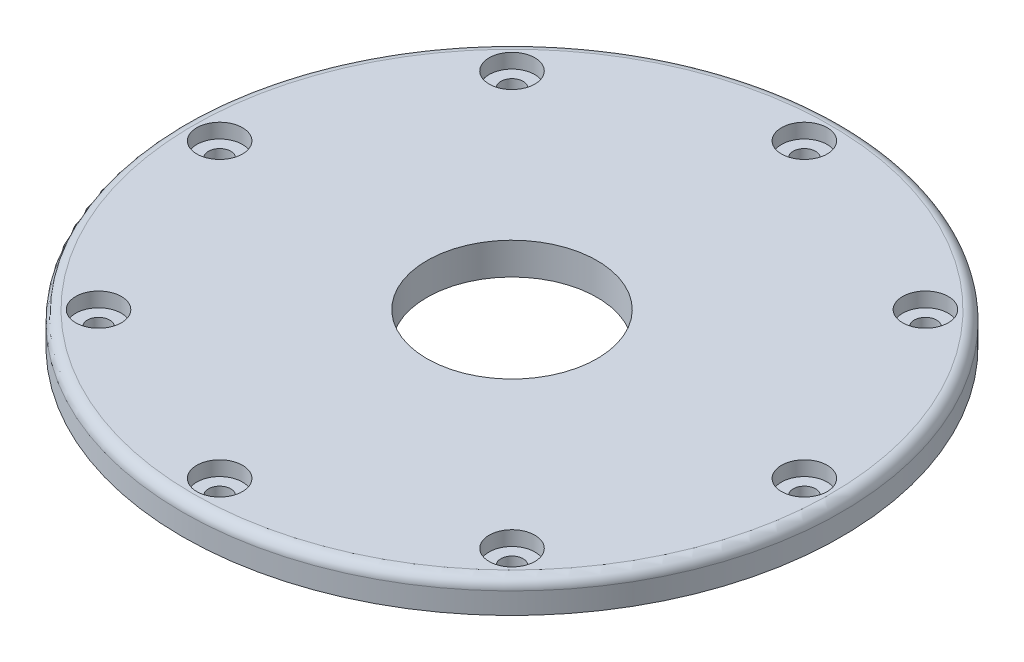
ISO-10303-21;
HEADER;
FILE_DESCRIPTION(('STEP AP214'),'2;1');
FILE_NAME('part.step','',(''),(''),'','','');
FILE_SCHEMA(('AUTOMOTIVE_DESIGN { 1 0 10303 214 1 1 1 1 }'));
ENDSEC;
DATA;
#1=APPLICATION_CONTEXT('core data for automotive mechanical design processes');
#2=APPLICATION_PROTOCOL_DEFINITION('international standard','automotive_design',2000,#1);
#3=PRODUCT_CONTEXT('',#1,'mechanical');
#4=PRODUCT('Part','Part','',(#3));
#5=PRODUCT_RELATED_PRODUCT_CATEGORY('part','',(#4));
#6=PRODUCT_DEFINITION_FORMATION('','',#4);
#7=PRODUCT_DEFINITION_CONTEXT('part definition',#1,'design');
#8=PRODUCT_DEFINITION('design','',#6,#7);
#9=PRODUCT_DEFINITION_SHAPE('','',#8);
#10=(LENGTH_UNIT() NAMED_UNIT(*) SI_UNIT(.MILLI.,.METRE.));
#11=(NAMED_UNIT(*) PLANE_ANGLE_UNIT() SI_UNIT($,.RADIAN.));
#12=(NAMED_UNIT(*) SI_UNIT($,.STERADIAN.) SOLID_ANGLE_UNIT());
#13=UNCERTAINTY_MEASURE_WITH_UNIT(LENGTH_MEASURE(1.E-05),#10,'distance_accuracy_value','');
#14=(GEOMETRIC_REPRESENTATION_CONTEXT(3) GLOBAL_UNCERTAINTY_ASSIGNED_CONTEXT((#13)) GLOBAL_UNIT_ASSIGNED_CONTEXT((#10,
#11,#12)) REPRESENTATION_CONTEXT('',''));
#15=CARTESIAN_POINT('',(0.,0.,0.));
#16=DIRECTION('',(0.,0.,1.));
#17=DIRECTION('',(1.,0.,0.));
#18=AXIS2_PLACEMENT_3D('',#15,#16,#17);
#19=CARTESIAN_POINT('',(0.,15.,0.));
#20=DIRECTION('',(0.,-1.,0.));
#21=DIRECTION('',(0.,0.,-1.));
#22=AXIS2_PLACEMENT_3D('',#19,#20,#21);
#23=CYLINDRICAL_SURFACE('',#22,155.);
#24=CARTESIAN_POINT('',(0.,10.,0.));
#25=DIRECTION('',(0.,1.,0.));
#26=DIRECTION('',(0.,0.,1.));
#27=AXIS2_PLACEMENT_3D('',#24,#25,#26);
#28=CIRCLE('',#27,155.);
#29=CARTESIAN_POINT('',(0.,10.,155.));
#30=VERTEX_POINT('',#29);
#31=EDGE_CURVE('E10',#30,#30,#28,.F.);
#32=ORIENTED_EDGE('',*,*,#31,.T.);
#33=EDGE_LOOP('',(#32));
#34=FACE_BOUND('',#33,.T.);
#35=CARTESIAN_POINT('',(0.,0.,0.));
#36=DIRECTION('',(0.,1.,0.));
#37=DIRECTION('',(0.,0.,1.));
#38=AXIS2_PLACEMENT_3D('',#35,#36,#37);
#39=CIRCLE('',#38,155.);
#40=CARTESIAN_POINT('',(0.,0.,155.));
#41=VERTEX_POINT('',#40);
#42=EDGE_CURVE('E41',#41,#41,#39,.T.);
#43=ORIENTED_EDGE('',*,*,#42,.T.);
#44=EDGE_LOOP('',(#43));
#45=FACE_BOUND('',#44,.T.);
#46=ADVANCED_FACE('F30',(#34,#45),#23,.T.);
#47=CARTESIAN_POINT('',(0.,15.,0.));
#48=DIRECTION('',(0.,1.,0.));
#49=DIRECTION('',(0.,0.,1.));
#50=AXIS2_PLACEMENT_3D('',#47,#48,#49);
#51=PLANE('',#50);
#52=CARTESIAN_POINT('',(0.,15.,0.));
#53=DIRECTION('',(0.,1.,0.));
#54=DIRECTION('',(0.,0.,1.));
#55=AXIS2_PLACEMENT_3D('',#52,#53,#54);
#56=CIRCLE('',#55,150.);
#57=CARTESIAN_POINT('',(0.,15.,150.));
#58=VERTEX_POINT('',#57);
#59=EDGE_CURVE('E37',#58,#58,#56,.T.);
#60=ORIENTED_EDGE('',*,*,#59,.T.);
#61=EDGE_LOOP('',(#60));
#62=FACE_BOUND('',#61,.T.);
#63=CARTESIAN_POINT('',(0.,15.,0.));
#64=DIRECTION('',(0.,1.,0.));
#65=DIRECTION('',(0.,0.,1.));
#66=AXIS2_PLACEMENT_3D('',#63,#64,#65);
#67=CIRCLE('',#66,40.);
#68=CARTESIAN_POINT('',(0.,15.,40.));
#69=VERTEX_POINT('',#68);
#70=EDGE_CURVE('E144',#69,#69,#67,.T.);
#71=ORIENTED_EDGE('',*,*,#70,.F.);
#72=EDGE_LOOP('',(#71));
#73=FACE_BOUND('',#72,.T.);
#74=CARTESIAN_POINT('',(97.2271824131491,15.,-97.2271824131515));
#75=DIRECTION('',(0.,1.,0.));
#76=DIRECTION('',(0.,0.,1.));
#77=AXIS2_PLACEMENT_3D('',#74,#75,#76);
#78=CIRCLE('',#77,10.74);
#79=CARTESIAN_POINT('',(97.2271824131491,15.,-86.4871824131515));
#80=VERTEX_POINT('',#79);
#81=EDGE_CURVE('E140',#80,#80,#78,.T.);
#82=ORIENTED_EDGE('',*,*,#81,.F.);
#83=EDGE_LOOP('',(#82));
#84=FACE_BOUND('',#83,.T.);
#85=CARTESIAN_POINT('',(137.5,15.,-1.44023605227279E-12));
#86=DIRECTION('',(0.,1.,0.));
#87=DIRECTION('',(0.,0.,1.));
#88=AXIS2_PLACEMENT_3D('',#85,#86,#87);
#89=CIRCLE('',#88,10.74);
#90=CARTESIAN_POINT('',(137.5,15.,10.7399999999986));
#91=VERTEX_POINT('',#90);
#92=EDGE_CURVE('E128',#91,#91,#89,.T.);
#93=ORIENTED_EDGE('',*,*,#92,.F.);
#94=EDGE_LOOP('',(#93));
#95=FACE_BOUND('',#94,.T.);
#96=CARTESIAN_POINT('',(97.2271824131511,15.,97.2271824131494));
#97=DIRECTION('',(0.,1.,0.));
#98=DIRECTION('',(0.,0.,1.));
#99=AXIS2_PLACEMENT_3D('',#96,#97,#98);
#100=CIRCLE('',#99,10.74);
#101=CARTESIAN_POINT('',(97.2271824131511,15.,107.967182413149));
#102=VERTEX_POINT('',#101);
#103=EDGE_CURVE('E116',#102,#102,#100,.T.);
#104=ORIENTED_EDGE('',*,*,#103,.F.);
#105=EDGE_LOOP('',(#104));
#106=FACE_BOUND('',#105,.T.);
#107=CARTESIAN_POINT('',(0.,15.,137.5));
#108=DIRECTION('',(0.,1.,0.));
#109=DIRECTION('',(0.,0.,1.));
#110=AXIS2_PLACEMENT_3D('',#107,#108,#109);
#111=CIRCLE('',#110,10.74);
#112=CARTESIAN_POINT('',(0.,15.,148.24));
#113=VERTEX_POINT('',#112);
#114=EDGE_CURVE('E104',#113,#113,#111,.T.);
#115=ORIENTED_EDGE('',*,*,#114,.F.);
#116=EDGE_LOOP('',(#115));
#117=FACE_BOUND('',#116,.T.);
#118=CARTESIAN_POINT('',(-97.2271824131498,15.,97.2271824131508));
#119=DIRECTION('',(0.,1.,0.));
#120=DIRECTION('',(0.,0.,1.));
#121=AXIS2_PLACEMENT_3D('',#118,#119,#120);
#122=CIRCLE('',#121,10.74);
#123=CARTESIAN_POINT('',(-97.2271824131498,15.,107.967182413151));
#124=VERTEX_POINT('',#123);
#125=EDGE_CURVE('E92',#124,#124,#122,.T.);
#126=ORIENTED_EDGE('',*,*,#125,.F.);
#127=EDGE_LOOP('',(#126));
#128=FACE_BOUND('',#127,.T.);
#129=CARTESIAN_POINT('',(-137.5,15.,4.80078684090931E-13));
#130=DIRECTION('',(0.,1.,0.));
#131=DIRECTION('',(0.,0.,1.));
#132=AXIS2_PLACEMENT_3D('',#129,#130,#131);
#133=CIRCLE('',#132,10.74);
#134=CARTESIAN_POINT('',(-137.5,15.,10.7400000000005));
#135=VERTEX_POINT('',#134);
#136=EDGE_CURVE('E80',#135,#135,#133,.T.);
#137=ORIENTED_EDGE('',*,*,#136,.F.);
#138=EDGE_LOOP('',(#137));
#139=FACE_BOUND('',#138,.T.);
#140=CARTESIAN_POINT('',(-97.2271824131505,15.,-97.2271824131501));
#141=DIRECTION('',(0.,1.,0.));
#142=DIRECTION('',(0.,0.,1.));
#143=AXIS2_PLACEMENT_3D('',#140,#141,#142);
#144=CIRCLE('',#143,10.74);
#145=CARTESIAN_POINT('',(-97.2271824131505,15.,-86.4871824131501));
#146=VERTEX_POINT('',#145);
#147=EDGE_CURVE('E68',#146,#146,#144,.T.);
#148=ORIENTED_EDGE('',*,*,#147,.F.);
#149=EDGE_LOOP('',(#148));
#150=FACE_BOUND('',#149,.T.);
#151=CARTESIAN_POINT('',(0.,15.,-137.5));
#152=DIRECTION('',(0.,1.,0.));
#153=DIRECTION('',(0.,0.,1.));
#154=AXIS2_PLACEMENT_3D('',#151,#152,#153);
#155=CIRCLE('',#154,10.74);
#156=CARTESIAN_POINT('',(0.,15.,-126.76));
#157=VERTEX_POINT('',#156);
#158=EDGE_CURVE('E56',#157,#157,#155,.T.);
#159=ORIENTED_EDGE('',*,*,#158,.F.);
#160=EDGE_LOOP('',(#159));
#161=FACE_BOUND('',#160,.T.);
#162=ADVANCED_FACE('F160',(#62,#73,#84,#95,#106,#117,#128,#139,#150,#161),#51,.T.);
#163=CARTESIAN_POINT('',(0.,0.,0.));
#164=DIRECTION('',(0.,1.,0.));
#165=DIRECTION('',(0.,0.,1.));
#166=AXIS2_PLACEMENT_3D('',#163,#164,#165);
#167=PLANE('',#166);
#168=CARTESIAN_POINT('',(0.,0.,0.));
#169=DIRECTION('',(0.,1.,0.));
#170=DIRECTION('',(0.,0.,1.));
#171=AXIS2_PLACEMENT_3D('',#168,#169,#170);
#172=CIRCLE('',#171,40.);
#173=CARTESIAN_POINT('',(0.,0.,40.));
#174=VERTEX_POINT('',#173);
#175=EDGE_CURVE('E143',#174,#174,#172,.T.);
#176=ORIENTED_EDGE('',*,*,#175,.T.);
#177=EDGE_LOOP('',(#176));
#178=FACE_BOUND('',#177,.T.);
#179=CARTESIAN_POINT('',(97.2271824131491,0.,-97.2271824131515));
#180=DIRECTION('',(0.,1.,0.));
#181=DIRECTION('',(0.,0.,1.));
#182=AXIS2_PLACEMENT_3D('',#179,#180,#181);
#183=CIRCLE('',#182,5.25);
#184=CARTESIAN_POINT('',(97.2271824131491,0.,-91.9771824131515));
#185=VERTEX_POINT('',#184);
#186=EDGE_CURVE('E131',#185,#185,#183,.T.);
#187=ORIENTED_EDGE('',*,*,#186,.T.);
#188=EDGE_LOOP('',(#187));
#189=FACE_BOUND('',#188,.T.);
#190=CARTESIAN_POINT('',(137.5,0.,-1.44023605227279E-12));
#191=DIRECTION('',(0.,1.,0.));
#192=DIRECTION('',(0.,0.,1.));
#193=AXIS2_PLACEMENT_3D('',#190,#191,#192);
#194=CIRCLE('',#193,5.25);
#195=CARTESIAN_POINT('',(137.5,0.,5.24999999999856));
#196=VERTEX_POINT('',#195);
#197=EDGE_CURVE('E119',#196,#196,#194,.T.);
#198=ORIENTED_EDGE('',*,*,#197,.T.);
#199=EDGE_LOOP('',(#198));
#200=FACE_BOUND('',#199,.T.);
#201=CARTESIAN_POINT('',(97.2271824131511,0.,97.2271824131494));
#202=DIRECTION('',(0.,1.,0.));
#203=DIRECTION('',(0.,0.,1.));
#204=AXIS2_PLACEMENT_3D('',#201,#202,#203);
#205=CIRCLE('',#204,5.25);
#206=CARTESIAN_POINT('',(97.2271824131511,0.,102.477182413149));
#207=VERTEX_POINT('',#206);
#208=EDGE_CURVE('E107',#207,#207,#205,.T.);
#209=ORIENTED_EDGE('',*,*,#208,.T.);
#210=EDGE_LOOP('',(#209));
#211=FACE_BOUND('',#210,.T.);
#212=CARTESIAN_POINT('',(0.,0.,137.5));
#213=DIRECTION('',(0.,1.,0.));
#214=DIRECTION('',(0.,0.,1.));
#215=AXIS2_PLACEMENT_3D('',#212,#213,#214);
#216=CIRCLE('',#215,5.25);
#217=CARTESIAN_POINT('',(0.,0.,142.75));
#218=VERTEX_POINT('',#217);
#219=EDGE_CURVE('E95',#218,#218,#216,.T.);
#220=ORIENTED_EDGE('',*,*,#219,.T.);
#221=EDGE_LOOP('',(#220));
#222=FACE_BOUND('',#221,.T.);
#223=CARTESIAN_POINT('',(-97.2271824131498,0.,97.2271824131508));
#224=DIRECTION('',(0.,1.,0.));
#225=DIRECTION('',(0.,0.,1.));
#226=AXIS2_PLACEMENT_3D('',#223,#224,#225);
#227=CIRCLE('',#226,5.25);
#228=CARTESIAN_POINT('',(-97.2271824131498,0.,102.477182413151));
#229=VERTEX_POINT('',#228);
#230=EDGE_CURVE('E83',#229,#229,#227,.T.);
#231=ORIENTED_EDGE('',*,*,#230,.T.);
#232=EDGE_LOOP('',(#231));
#233=FACE_BOUND('',#232,.T.);
#234=CARTESIAN_POINT('',(-137.5,0.,4.80078684090931E-13));
#235=DIRECTION('',(0.,1.,0.));
#236=DIRECTION('',(0.,0.,1.));
#237=AXIS2_PLACEMENT_3D('',#234,#235,#236);
#238=CIRCLE('',#237,5.25);
#239=CARTESIAN_POINT('',(-137.5,0.,5.25000000000048));
#240=VERTEX_POINT('',#239);
#241=EDGE_CURVE('E71',#240,#240,#238,.T.);
#242=ORIENTED_EDGE('',*,*,#241,.T.);
#243=EDGE_LOOP('',(#242));
#244=FACE_BOUND('',#243,.T.);
#245=CARTESIAN_POINT('',(-97.2271824131505,0.,-97.2271824131501));
#246=DIRECTION('',(0.,1.,0.));
#247=DIRECTION('',(0.,0.,1.));
#248=AXIS2_PLACEMENT_3D('',#245,#246,#247);
#249=CIRCLE('',#248,5.25);
#250=CARTESIAN_POINT('',(-97.2271824131505,0.,-91.9771824131501));
#251=VERTEX_POINT('',#250);
#252=EDGE_CURVE('E59',#251,#251,#249,.T.);
#253=ORIENTED_EDGE('',*,*,#252,.T.);
#254=EDGE_LOOP('',(#253));
#255=FACE_BOUND('',#254,.T.);
#256=CARTESIAN_POINT('',(0.,0.,-137.5));
#257=DIRECTION('',(0.,1.,0.));
#258=DIRECTION('',(0.,0.,1.));
#259=AXIS2_PLACEMENT_3D('',#256,#257,#258);
#260=CIRCLE('',#259,5.25);
#261=CARTESIAN_POINT('',(0.,0.,-132.25));
#262=VERTEX_POINT('',#261);
#263=EDGE_CURVE('E45',#262,#262,#260,.T.);
#264=ORIENTED_EDGE('',*,*,#263,.T.);
#265=EDGE_LOOP('',(#264));
#266=FACE_BOUND('',#265,.T.);
#267=ORIENTED_EDGE('',*,*,#42,.F.);
#268=EDGE_LOOP('',(#267));
#269=FACE_BOUND('',#268,.T.);
#270=ADVANCED_FACE('F150',(#178,#189,#200,#211,#222,#233,#244,#255,#266,#269),#167,.F.);
#271=CARTESIAN_POINT('',(0.,15.,-137.5));
#272=DIRECTION('',(0.,1.,0.));
#273=DIRECTION('',(0.,0.,1.));
#274=AXIS2_PLACEMENT_3D('',#271,#272,#273);
#275=CYLINDRICAL_SURFACE('',#274,5.25000000000001);
#276=ORIENTED_EDGE('',*,*,#263,.F.);
#277=EDGE_LOOP('',(#276));
#278=FACE_BOUND('',#277,.T.);
#279=CARTESIAN_POINT('',(0.,8.15,-137.5));
#280=DIRECTION('',(0.,1.,0.));
#281=DIRECTION('',(0.,0.,1.));
#282=AXIS2_PLACEMENT_3D('',#279,#280,#281);
#283=CIRCLE('',#282,5.25000000000001);
#284=CARTESIAN_POINT('',(0.,8.15,-132.25));
#285=VERTEX_POINT('',#284);
#286=EDGE_CURVE('E50',#285,#285,#283,.T.);
#287=ORIENTED_EDGE('',*,*,#286,.T.);
#288=EDGE_LOOP('',(#287));
#289=FACE_BOUND('',#288,.T.);
#290=ADVANCED_FACE('F193',(#278,#289),#275,.F.);
#291=CARTESIAN_POINT('',(5.25000000000001,8.15,-137.5));
#292=DIRECTION('',(0.,-1.,0.));
#293=DIRECTION('',(0.,0.,-1.));
#294=AXIS2_PLACEMENT_3D('',#291,#292,#293);
#295=PLANE('',#294);
#296=ORIENTED_EDGE('',*,*,#286,.F.);
#297=EDGE_LOOP('',(#296));
#298=FACE_BOUND('',#297,.T.);
#299=CARTESIAN_POINT('',(0.,8.15,-137.5));
#300=DIRECTION('',(0.,1.,0.));
#301=DIRECTION('',(0.,0.,1.));
#302=AXIS2_PLACEMENT_3D('',#299,#300,#301);
#303=CIRCLE('',#302,10.74);
#304=CARTESIAN_POINT('',(0.,8.15,-126.76));
#305=VERTEX_POINT('',#304);
#306=EDGE_CURVE('E53',#305,#305,#303,.T.);
#307=ORIENTED_EDGE('',*,*,#306,.T.);
#308=EDGE_LOOP('',(#307));
#309=FACE_BOUND('',#308,.T.);
#310=ADVANCED_FACE('F183',(#298,#309),#295,.F.);
#311=CARTESIAN_POINT('',(0.,15.,-137.5));
#312=DIRECTION('',(0.,1.,0.));
#313=DIRECTION('',(0.,0.,1.));
#314=AXIS2_PLACEMENT_3D('',#311,#312,#313);
#315=CYLINDRICAL_SURFACE('',#314,10.74);
#316=ORIENTED_EDGE('',*,*,#306,.F.);
#317=EDGE_LOOP('',(#316));
#318=FACE_BOUND('',#317,.T.);
#319=ORIENTED_EDGE('',*,*,#158,.T.);
#320=EDGE_LOOP('',(#319));
#321=FACE_BOUND('',#320,.T.);
#322=ADVANCED_FACE('F180',(#318,#321),#315,.F.);
#323=CARTESIAN_POINT('',(-97.2271824131505,15.,-97.2271824131501));
#324=DIRECTION('',(0.,1.,0.));
#325=DIRECTION('',(0.,0.,1.));
#326=AXIS2_PLACEMENT_3D('',#323,#324,#325);
#327=CYLINDRICAL_SURFACE('',#326,5.25);
#328=ORIENTED_EDGE('',*,*,#252,.F.);
#329=EDGE_LOOP('',(#328));
#330=FACE_BOUND('',#329,.T.);
#331=CARTESIAN_POINT('',(-97.2271824131505,8.15,-97.2271824131501));
#332=DIRECTION('',(0.,1.,0.));
#333=DIRECTION('',(0.,0.,1.));
#334=AXIS2_PLACEMENT_3D('',#331,#332,#333);
#335=CIRCLE('',#334,5.25);
#336=CARTESIAN_POINT('',(-97.2271824131505,8.15,-91.9771824131501));
#337=VERTEX_POINT('',#336);
#338=EDGE_CURVE('E62',#337,#337,#335,.T.);
#339=ORIENTED_EDGE('',*,*,#338,.T.);
#340=EDGE_LOOP('',(#339));
#341=FACE_BOUND('',#340,.T.);
#342=ADVANCED_FACE('F182',(#330,#341),#327,.F.);
#343=CARTESIAN_POINT('',(-91.9771824131505,8.15,-97.2271824131501));
#344=DIRECTION('',(0.,-1.,0.));
#345=DIRECTION('',(0.,0.,-1.));
#346=AXIS2_PLACEMENT_3D('',#343,#344,#345);
#347=PLANE('',#346);
#348=ORIENTED_EDGE('',*,*,#338,.F.);
#349=EDGE_LOOP('',(#348));
#350=FACE_BOUND('',#349,.T.);
#351=CARTESIAN_POINT('',(-97.2271824131505,8.15,-97.2271824131501));
#352=DIRECTION('',(0.,1.,0.));
#353=DIRECTION('',(0.,0.,1.));
#354=AXIS2_PLACEMENT_3D('',#351,#352,#353);
#355=CIRCLE('',#354,10.74);
#356=CARTESIAN_POINT('',(-97.2271824131505,8.15,-86.4871824131501));
#357=VERTEX_POINT('',#356);
#358=EDGE_CURVE('E65',#357,#357,#355,.T.);
#359=ORIENTED_EDGE('',*,*,#358,.T.);
#360=EDGE_LOOP('',(#359));
#361=FACE_BOUND('',#360,.T.);
#362=ADVANCED_FACE('F190',(#350,#361),#347,.F.);
#363=CARTESIAN_POINT('',(-97.2271824131505,15.,-97.2271824131501));
#364=DIRECTION('',(0.,1.,0.));
#365=DIRECTION('',(0.,0.,1.));
#366=AXIS2_PLACEMENT_3D('',#363,#364,#365);
#367=CYLINDRICAL_SURFACE('',#366,10.74);
#368=ORIENTED_EDGE('',*,*,#358,.F.);
#369=EDGE_LOOP('',(#368));
#370=FACE_BOUND('',#369,.T.);
#371=ORIENTED_EDGE('',*,*,#147,.T.);
#372=EDGE_LOOP('',(#371));
#373=FACE_BOUND('',#372,.T.);
#374=ADVANCED_FACE('F240',(#370,#373),#367,.F.);
#375=CARTESIAN_POINT('',(-137.5,15.,4.80078684090931E-13));
#376=DIRECTION('',(0.,1.,0.));
#377=DIRECTION('',(0.,0.,1.));
#378=AXIS2_PLACEMENT_3D('',#375,#376,#377);
#379=CYLINDRICAL_SURFACE('',#378,5.25);
#380=ORIENTED_EDGE('',*,*,#241,.F.);
#381=EDGE_LOOP('',(#380));
#382=FACE_BOUND('',#381,.T.);
#383=CARTESIAN_POINT('',(-137.5,8.15,4.80078684090931E-13));
#384=DIRECTION('',(0.,1.,0.));
#385=DIRECTION('',(0.,0.,1.));
#386=AXIS2_PLACEMENT_3D('',#383,#384,#385);
#387=CIRCLE('',#386,5.25);
#388=CARTESIAN_POINT('',(-137.5,8.15,5.25000000000048));
#389=VERTEX_POINT('',#388);
#390=EDGE_CURVE('E74',#389,#389,#387,.T.);
#391=ORIENTED_EDGE('',*,*,#390,.T.);
#392=EDGE_LOOP('',(#391));
#393=FACE_BOUND('',#392,.T.);
#394=ADVANCED_FACE('F250',(#382,#393),#379,.F.);
#395=CARTESIAN_POINT('',(-132.25,8.15,4.80078684090931E-13));
#396=DIRECTION('',(0.,-1.,0.));
#397=DIRECTION('',(0.,0.,-1.));
#398=AXIS2_PLACEMENT_3D('',#395,#396,#397);
#399=PLANE('',#398);
#400=ORIENTED_EDGE('',*,*,#390,.F.);
#401=EDGE_LOOP('',(#400));
#402=FACE_BOUND('',#401,.T.);
#403=CARTESIAN_POINT('',(-137.5,8.15,4.80078684090931E-13));
#404=DIRECTION('',(0.,1.,0.));
#405=DIRECTION('',(0.,0.,1.));
#406=AXIS2_PLACEMENT_3D('',#403,#404,#405);
#407=CIRCLE('',#406,10.74);
#408=CARTESIAN_POINT('',(-137.5,8.15,10.7400000000005));
#409=VERTEX_POINT('',#408);
#410=EDGE_CURVE('E77',#409,#409,#407,.T.);
#411=ORIENTED_EDGE('',*,*,#410,.T.);
#412=EDGE_LOOP('',(#411));
#413=FACE_BOUND('',#412,.T.);
#414=ADVANCED_FACE('F260',(#402,#413),#399,.F.);
#415=CARTESIAN_POINT('',(-137.5,15.,4.80078684090931E-13));
#416=DIRECTION('',(0.,1.,0.));
#417=DIRECTION('',(0.,0.,1.));
#418=AXIS2_PLACEMENT_3D('',#415,#416,#417);
#419=CYLINDRICAL_SURFACE('',#418,10.74);
#420=ORIENTED_EDGE('',*,*,#410,.F.);
#421=EDGE_LOOP('',(#420));
#422=FACE_BOUND('',#421,.T.);
#423=ORIENTED_EDGE('',*,*,#136,.T.);
#424=EDGE_LOOP('',(#423));
#425=FACE_BOUND('',#424,.T.);
#426=ADVANCED_FACE('F270',(#422,#425),#419,.F.);
#427=CARTESIAN_POINT('',(-97.2271824131498,15.,97.2271824131508));
#428=DIRECTION('',(0.,1.,0.));
#429=DIRECTION('',(0.,0.,1.));
#430=AXIS2_PLACEMENT_3D('',#427,#428,#429);
#431=CYLINDRICAL_SURFACE('',#430,5.25);
#432=ORIENTED_EDGE('',*,*,#230,.F.);
#433=EDGE_LOOP('',(#432));
#434=FACE_BOUND('',#433,.T.);
#435=CARTESIAN_POINT('',(-97.2271824131498,8.15,97.2271824131508));
#436=DIRECTION('',(0.,1.,0.));
#437=DIRECTION('',(0.,0.,1.));
#438=AXIS2_PLACEMENT_3D('',#435,#436,#437);
#439=CIRCLE('',#438,5.25);
#440=CARTESIAN_POINT('',(-97.2271824131498,8.15,102.477182413151));
#441=VERTEX_POINT('',#440);
#442=EDGE_CURVE('E86',#441,#441,#439,.T.);
#443=ORIENTED_EDGE('',*,*,#442,.T.);
#444=EDGE_LOOP('',(#443));
#445=FACE_BOUND('',#444,.T.);
#446=ADVANCED_FACE('F280',(#434,#445),#431,.F.);
#447=CARTESIAN_POINT('',(-91.9771824131498,8.15,97.2271824131508));
#448=DIRECTION('',(0.,-1.,0.));
#449=DIRECTION('',(0.,0.,-1.));
#450=AXIS2_PLACEMENT_3D('',#447,#448,#449);
#451=PLANE('',#450);
#452=ORIENTED_EDGE('',*,*,#442,.F.);
#453=EDGE_LOOP('',(#452));
#454=FACE_BOUND('',#453,.T.);
#455=CARTESIAN_POINT('',(-97.2271824131498,8.15,97.2271824131508));
#456=DIRECTION('',(0.,1.,0.));
#457=DIRECTION('',(0.,0.,1.));
#458=AXIS2_PLACEMENT_3D('',#455,#456,#457);
#459=CIRCLE('',#458,10.74);
#460=CARTESIAN_POINT('',(-97.2271824131498,8.15,107.967182413151));
#461=VERTEX_POINT('',#460);
#462=EDGE_CURVE('E89',#461,#461,#459,.T.);
#463=ORIENTED_EDGE('',*,*,#462,.T.);
#464=EDGE_LOOP('',(#463));
#465=FACE_BOUND('',#464,.T.);
#466=ADVANCED_FACE('F290',(#454,#465),#451,.F.);
#467=CARTESIAN_POINT('',(-97.2271824131498,15.,97.2271824131508));
#468=DIRECTION('',(0.,1.,0.));
#469=DIRECTION('',(0.,0.,1.));
#470=AXIS2_PLACEMENT_3D('',#467,#468,#469);
#471=CYLINDRICAL_SURFACE('',#470,10.74);
#472=ORIENTED_EDGE('',*,*,#462,.F.);
#473=EDGE_LOOP('',(#472));
#474=FACE_BOUND('',#473,.T.);
#475=ORIENTED_EDGE('',*,*,#125,.T.);
#476=EDGE_LOOP('',(#475));
#477=FACE_BOUND('',#476,.T.);
#478=ADVANCED_FACE('F300',(#474,#477),#471,.F.);
#479=CARTESIAN_POINT('',(0.,15.,137.5));
#480=DIRECTION('',(0.,1.,0.));
#481=DIRECTION('',(0.,0.,1.));
#482=AXIS2_PLACEMENT_3D('',#479,#480,#481);
#483=CYLINDRICAL_SURFACE('',#482,5.25000000000001);
#484=ORIENTED_EDGE('',*,*,#219,.F.);
#485=EDGE_LOOP('',(#484));
#486=FACE_BOUND('',#485,.T.);
#487=CARTESIAN_POINT('',(0.,8.15,137.5));
#488=DIRECTION('',(0.,1.,0.));
#489=DIRECTION('',(0.,0.,1.));
#490=AXIS2_PLACEMENT_3D('',#487,#488,#489);
#491=CIRCLE('',#490,5.25000000000001);
#492=CARTESIAN_POINT('',(0.,8.15,142.75));
#493=VERTEX_POINT('',#492);
#494=EDGE_CURVE('E98',#493,#493,#491,.T.);
#495=ORIENTED_EDGE('',*,*,#494,.T.);
#496=EDGE_LOOP('',(#495));
#497=FACE_BOUND('',#496,.T.);
#498=ADVANCED_FACE('F310',(#486,#497),#483,.F.);
#499=CARTESIAN_POINT('',(5.25000000000001,8.15,137.5));
#500=DIRECTION('',(0.,-1.,0.));
#501=DIRECTION('',(0.,0.,-1.));
#502=AXIS2_PLACEMENT_3D('',#499,#500,#501);
#503=PLANE('',#502);
#504=ORIENTED_EDGE('',*,*,#494,.F.);
#505=EDGE_LOOP('',(#504));
#506=FACE_BOUND('',#505,.T.);
#507=CARTESIAN_POINT('',(0.,8.15,137.5));
#508=DIRECTION('',(0.,1.,0.));
#509=DIRECTION('',(0.,0.,1.));
#510=AXIS2_PLACEMENT_3D('',#507,#508,#509);
#511=CIRCLE('',#510,10.74);
#512=CARTESIAN_POINT('',(0.,8.15,148.24));
#513=VERTEX_POINT('',#512);
#514=EDGE_CURVE('E101',#513,#513,#511,.T.);
#515=ORIENTED_EDGE('',*,*,#514,.T.);
#516=EDGE_LOOP('',(#515));
#517=FACE_BOUND('',#516,.T.);
#518=ADVANCED_FACE('F320',(#506,#517),#503,.F.);
#519=CARTESIAN_POINT('',(0.,15.,137.5));
#520=DIRECTION('',(0.,1.,0.));
#521=DIRECTION('',(0.,0.,1.));
#522=AXIS2_PLACEMENT_3D('',#519,#520,#521);
#523=CYLINDRICAL_SURFACE('',#522,10.74);
#524=ORIENTED_EDGE('',*,*,#514,.F.);
#525=EDGE_LOOP('',(#524));
#526=FACE_BOUND('',#525,.T.);
#527=ORIENTED_EDGE('',*,*,#114,.T.);
#528=EDGE_LOOP('',(#527));
#529=FACE_BOUND('',#528,.T.);
#530=ADVANCED_FACE('F330',(#526,#529),#523,.F.);
#531=CARTESIAN_POINT('',(97.2271824131511,15.,97.2271824131494));
#532=DIRECTION('',(0.,1.,0.));
#533=DIRECTION('',(0.,0.,1.));
#534=AXIS2_PLACEMENT_3D('',#531,#532,#533);
#535=CYLINDRICAL_SURFACE('',#534,5.25);
#536=ORIENTED_EDGE('',*,*,#208,.F.);
#537=EDGE_LOOP('',(#536));
#538=FACE_BOUND('',#537,.T.);
#539=CARTESIAN_POINT('',(97.2271824131511,8.15,97.2271824131494));
#540=DIRECTION('',(0.,1.,0.));
#541=DIRECTION('',(0.,0.,1.));
#542=AXIS2_PLACEMENT_3D('',#539,#540,#541);
#543=CIRCLE('',#542,5.25);
#544=CARTESIAN_POINT('',(97.2271824131511,8.15,102.477182413149));
#545=VERTEX_POINT('',#544);
#546=EDGE_CURVE('E110',#545,#545,#543,.T.);
#547=ORIENTED_EDGE('',*,*,#546,.T.);
#548=EDGE_LOOP('',(#547));
#549=FACE_BOUND('',#548,.T.);
#550=ADVANCED_FACE('F340',(#538,#549),#535,.F.);
#551=CARTESIAN_POINT('',(102.477182413151,8.15,97.2271824131494));
#552=DIRECTION('',(0.,-1.,0.));
#553=DIRECTION('',(0.,0.,-1.));
#554=AXIS2_PLACEMENT_3D('',#551,#552,#553);
#555=PLANE('',#554);
#556=ORIENTED_EDGE('',*,*,#546,.F.);
#557=EDGE_LOOP('',(#556));
#558=FACE_BOUND('',#557,.T.);
#559=CARTESIAN_POINT('',(97.2271824131511,8.15,97.2271824131494));
#560=DIRECTION('',(0.,1.,0.));
#561=DIRECTION('',(0.,0.,1.));
#562=AXIS2_PLACEMENT_3D('',#559,#560,#561);
#563=CIRCLE('',#562,10.74);
#564=CARTESIAN_POINT('',(97.2271824131511,8.15,107.967182413149));
#565=VERTEX_POINT('',#564);
#566=EDGE_CURVE('E113',#565,#565,#563,.T.);
#567=ORIENTED_EDGE('',*,*,#566,.T.);
#568=EDGE_LOOP('',(#567));
#569=FACE_BOUND('',#568,.T.);
#570=ADVANCED_FACE('F350',(#558,#569),#555,.F.);
#571=CARTESIAN_POINT('',(97.2271824131511,15.,97.2271824131494));
#572=DIRECTION('',(0.,1.,0.));
#573=DIRECTION('',(0.,0.,1.));
#574=AXIS2_PLACEMENT_3D('',#571,#572,#573);
#575=CYLINDRICAL_SURFACE('',#574,10.74);
#576=ORIENTED_EDGE('',*,*,#566,.F.);
#577=EDGE_LOOP('',(#576));
#578=FACE_BOUND('',#577,.T.);
#579=ORIENTED_EDGE('',*,*,#103,.T.);
#580=EDGE_LOOP('',(#579));
#581=FACE_BOUND('',#580,.T.);
#582=ADVANCED_FACE('F360',(#578,#581),#575,.F.);
#583=CARTESIAN_POINT('',(137.5,15.,-1.44023605227279E-12));
#584=DIRECTION('',(0.,1.,0.));
#585=DIRECTION('',(0.,0.,1.));
#586=AXIS2_PLACEMENT_3D('',#583,#584,#585);
#587=CYLINDRICAL_SURFACE('',#586,5.25);
#588=ORIENTED_EDGE('',*,*,#197,.F.);
#589=EDGE_LOOP('',(#588));
#590=FACE_BOUND('',#589,.T.);
#591=CARTESIAN_POINT('',(137.5,8.15,-1.44023605227279E-12));
#592=DIRECTION('',(0.,1.,0.));
#593=DIRECTION('',(0.,0.,1.));
#594=AXIS2_PLACEMENT_3D('',#591,#592,#593);
#595=CIRCLE('',#594,5.25);
#596=CARTESIAN_POINT('',(137.5,8.15,5.24999999999856));
#597=VERTEX_POINT('',#596);
#598=EDGE_CURVE('E122',#597,#597,#595,.T.);
#599=ORIENTED_EDGE('',*,*,#598,.T.);
#600=EDGE_LOOP('',(#599));
#601=FACE_BOUND('',#600,.T.);
#602=ADVANCED_FACE('F370',(#590,#601),#587,.F.);
#603=CARTESIAN_POINT('',(142.75,8.15,-1.44023605227279E-12));
#604=DIRECTION('',(0.,-1.,0.));
#605=DIRECTION('',(0.,0.,-1.));
#606=AXIS2_PLACEMENT_3D('',#603,#604,#605);
#607=PLANE('',#606);
#608=ORIENTED_EDGE('',*,*,#598,.F.);
#609=EDGE_LOOP('',(#608));
#610=FACE_BOUND('',#609,.T.);
#611=CARTESIAN_POINT('',(137.5,8.15,-1.44023605227279E-12));
#612=DIRECTION('',(0.,1.,0.));
#613=DIRECTION('',(0.,0.,1.));
#614=AXIS2_PLACEMENT_3D('',#611,#612,#613);
#615=CIRCLE('',#614,10.74);
#616=CARTESIAN_POINT('',(137.5,8.15,10.7399999999986));
#617=VERTEX_POINT('',#616);
#618=EDGE_CURVE('E125',#617,#617,#615,.T.);
#619=ORIENTED_EDGE('',*,*,#618,.T.);
#620=EDGE_LOOP('',(#619));
#621=FACE_BOUND('',#620,.T.);
#622=ADVANCED_FACE('F380',(#610,#621),#607,.F.);
#623=CARTESIAN_POINT('',(137.5,15.,-1.44023605227279E-12));
#624=DIRECTION('',(0.,1.,0.));
#625=DIRECTION('',(0.,0.,1.));
#626=AXIS2_PLACEMENT_3D('',#623,#624,#625);
#627=CYLINDRICAL_SURFACE('',#626,10.74);
#628=ORIENTED_EDGE('',*,*,#618,.F.);
#629=EDGE_LOOP('',(#628));
#630=FACE_BOUND('',#629,.T.);
#631=ORIENTED_EDGE('',*,*,#92,.T.);
#632=EDGE_LOOP('',(#631));
#633=FACE_BOUND('',#632,.T.);
#634=ADVANCED_FACE('F390',(#630,#633),#627,.F.);
#635=CARTESIAN_POINT('',(97.2271824131491,15.,-97.2271824131515));
#636=DIRECTION('',(0.,1.,0.));
#637=DIRECTION('',(0.,0.,1.));
#638=AXIS2_PLACEMENT_3D('',#635,#636,#637);
#639=CYLINDRICAL_SURFACE('',#638,5.25);
#640=ORIENTED_EDGE('',*,*,#186,.F.);
#641=EDGE_LOOP('',(#640));
#642=FACE_BOUND('',#641,.T.);
#643=CARTESIAN_POINT('',(97.2271824131491,8.15,-97.2271824131515));
#644=DIRECTION('',(0.,1.,0.));
#645=DIRECTION('',(0.,0.,1.));
#646=AXIS2_PLACEMENT_3D('',#643,#644,#645);
#647=CIRCLE('',#646,5.25);
#648=CARTESIAN_POINT('',(97.2271824131491,8.15,-91.9771824131515));
#649=VERTEX_POINT('',#648);
#650=EDGE_CURVE('E134',#649,#649,#647,.T.);
#651=ORIENTED_EDGE('',*,*,#650,.T.);
#652=EDGE_LOOP('',(#651));
#653=FACE_BOUND('',#652,.T.);
#654=ADVANCED_FACE('F400',(#642,#653),#639,.F.);
#655=CARTESIAN_POINT('',(102.477182413149,8.15,-97.2271824131515));
#656=DIRECTION('',(0.,-1.,0.));
#657=DIRECTION('',(0.,0.,-1.));
#658=AXIS2_PLACEMENT_3D('',#655,#656,#657);
#659=PLANE('',#658);
#660=ORIENTED_EDGE('',*,*,#650,.F.);
#661=EDGE_LOOP('',(#660));
#662=FACE_BOUND('',#661,.T.);
#663=CARTESIAN_POINT('',(97.2271824131491,8.15,-97.2271824131515));
#664=DIRECTION('',(0.,1.,0.));
#665=DIRECTION('',(0.,0.,1.));
#666=AXIS2_PLACEMENT_3D('',#663,#664,#665);
#667=CIRCLE('',#666,10.74);
#668=CARTESIAN_POINT('',(97.2271824131491,8.15,-86.4871824131515));
#669=VERTEX_POINT('',#668);
#670=EDGE_CURVE('E137',#669,#669,#667,.T.);
#671=ORIENTED_EDGE('',*,*,#670,.T.);
#672=EDGE_LOOP('',(#671));
#673=FACE_BOUND('',#672,.T.);
#674=ADVANCED_FACE('F410',(#662,#673),#659,.F.);
#675=CARTESIAN_POINT('',(97.2271824131491,15.,-97.2271824131515));
#676=DIRECTION('',(0.,1.,0.));
#677=DIRECTION('',(0.,0.,1.));
#678=AXIS2_PLACEMENT_3D('',#675,#676,#677);
#679=CYLINDRICAL_SURFACE('',#678,10.74);
#680=ORIENTED_EDGE('',*,*,#670,.F.);
#681=EDGE_LOOP('',(#680));
#682=FACE_BOUND('',#681,.T.);
#683=ORIENTED_EDGE('',*,*,#81,.T.);
#684=EDGE_LOOP('',(#683));
#685=FACE_BOUND('',#684,.T.);
#686=ADVANCED_FACE('F156',(#682,#685),#679,.F.);
#687=CARTESIAN_POINT('',(0.,0.,0.));
#688=DIRECTION('',(0.,1.,0.));
#689=DIRECTION('',(0.,0.,1.));
#690=AXIS2_PLACEMENT_3D('',#687,#688,#689);
#691=CYLINDRICAL_SURFACE('',#690,40.);
#692=ORIENTED_EDGE('',*,*,#175,.F.);
#693=EDGE_LOOP('',(#692));
#694=FACE_BOUND('',#693,.T.);
#695=ORIENTED_EDGE('',*,*,#70,.T.);
#696=EDGE_LOOP('',(#695));
#697=FACE_BOUND('',#696,.T.);
#698=ADVANCED_FACE('F153',(#694,#697),#691,.F.);
#699=CARTESIAN_POINT('',(0.,10.,0.));
#700=DIRECTION('',(0.,1.,0.));
#701=DIRECTION('',(0.,0.,1.));
#702=AXIS2_PLACEMENT_3D('',#699,#700,#701);
#703=TOROIDAL_SURFACE('',#702,150.,5.);
#704=ORIENTED_EDGE('',*,*,#31,.F.);
#705=EDGE_LOOP('',(#704));
#706=FACE_BOUND('',#705,.T.);
#707=ORIENTED_EDGE('',*,*,#59,.F.);
#708=EDGE_LOOP('',(#707));
#709=FACE_BOUND('',#708,.T.);
#710=ADVANCED_FACE('F32',(#706,#709),#703,.T.);
#711=CLOSED_SHELL('',(#46,#162,#270,#290,#310,#322,#342,#362,#374,#394,#414,#426,#446,#466,#478,
#498,#518,#530,#550,#570,#582,#602,#622,#634,#654,#674,#686,#698,#710));
#712=MANIFOLD_SOLID_BREP('B2',#711);
#713=ADVANCED_BREP_SHAPE_REPRESENTATION('',(#18,#712),#14);
#714=SHAPE_DEFINITION_REPRESENTATION(#9,#713);
ENDSEC;
END-ISO-10303-21;
